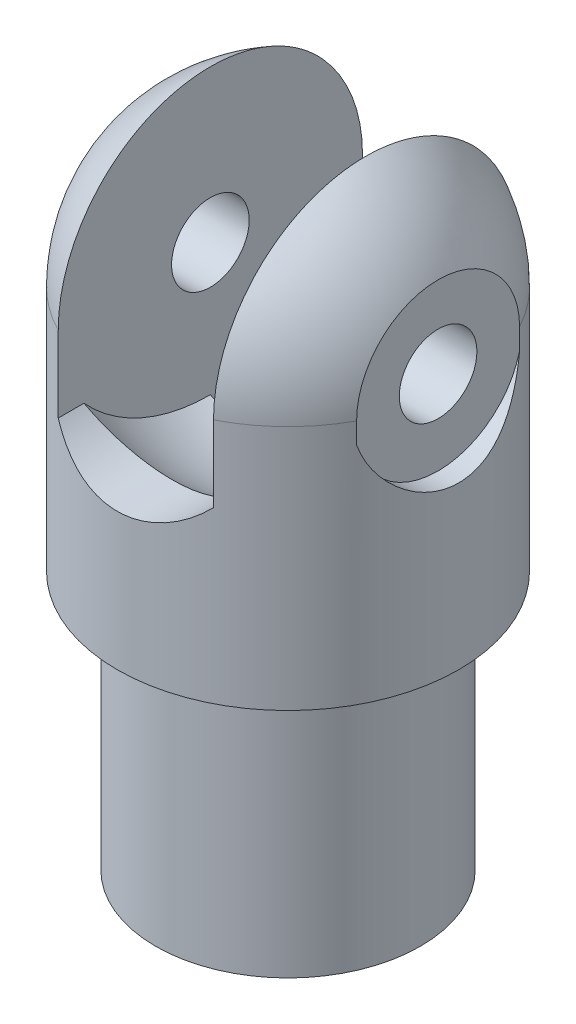
ISO-10303-21;
HEADER;
FILE_DESCRIPTION(('STEP AP214'),'2;1');
FILE_NAME('part.step','',(''),(''),'','','');
FILE_SCHEMA(('AUTOMOTIVE_DESIGN { 1 0 10303 214 1 1 1 1 }'));
ENDSEC;
DATA;
#1=APPLICATION_CONTEXT('core data for automotive mechanical design processes');
#2=APPLICATION_PROTOCOL_DEFINITION('international standard','automotive_design',2000,#1);
#3=PRODUCT_CONTEXT('',#1,'mechanical');
#4=PRODUCT('Part','Part','',(#3));
#5=PRODUCT_RELATED_PRODUCT_CATEGORY('part','',(#4));
#6=PRODUCT_DEFINITION_FORMATION('','',#4);
#7=PRODUCT_DEFINITION_CONTEXT('part definition',#1,'design');
#8=PRODUCT_DEFINITION('design','',#6,#7);
#9=PRODUCT_DEFINITION_SHAPE('','',#8);
#10=(LENGTH_UNIT() NAMED_UNIT(*) SI_UNIT(.MILLI.,.METRE.));
#11=(NAMED_UNIT(*) PLANE_ANGLE_UNIT() SI_UNIT($,.RADIAN.));
#12=(NAMED_UNIT(*) SI_UNIT($,.STERADIAN.) SOLID_ANGLE_UNIT());
#13=UNCERTAINTY_MEASURE_WITH_UNIT(LENGTH_MEASURE(1.E-05),#10,'distance_accuracy_value','');
#14=(GEOMETRIC_REPRESENTATION_CONTEXT(3) GLOBAL_UNCERTAINTY_ASSIGNED_CONTEXT((#13)) GLOBAL_UNIT_ASSIGNED_CONTEXT((#10,
#11,#12)) REPRESENTATION_CONTEXT('',''));
#15=CARTESIAN_POINT('',(0.,0.,0.));
#16=DIRECTION('',(0.,0.,1.));
#17=DIRECTION('',(1.,0.,0.));
#18=AXIS2_PLACEMENT_3D('',#15,#16,#17);
#19=CARTESIAN_POINT('',(0.,25.4,0.));
#20=DIRECTION('',(0.,-1.,0.));
#21=DIRECTION('',(0.,0.,-1.));
#22=AXIS2_PLACEMENT_3D('',#19,#20,#21);
#23=CYLINDRICAL_SURFACE('',#22,16.764);
#24=CARTESIAN_POINT('',(0.,25.4,0.));
#25=DIRECTION('',(0.,-1.,0.));
#26=DIRECTION('',(0.,0.,-1.));
#27=AXIS2_PLACEMENT_3D('',#24,#25,#26);
#28=CIRCLE('',#27,16.764);
#29=CARTESIAN_POINT('',(0.,25.4,-16.764));
#30=VERTEX_POINT('',#29);
#31=EDGE_CURVE('E236',#30,#30,#28,.T.);
#32=ORIENTED_EDGE('',*,*,#31,.F.);
#33=EDGE_LOOP('',(#32));
#34=FACE_BOUND('',#33,.T.);
#35=CARTESIAN_POINT('',(7.61999999999999,42.0639552639968,14.9320894720063));
#36=CARTESIAN_POINT('',(7.4187354852081,41.8585568840087,15.034819957129));
#37=CARTESIAN_POINT('',(7.20894008160445,41.661035373104,15.1367292765877));
#38=CARTESIAN_POINT('',(6.77286746114195,41.2827009786058,15.3367976218014));
#39=CARTESIAN_POINT('',(6.54657970393835,41.10189895096,15.4349541869733));
#40=CARTESIAN_POINT('',(6.07673523785476,40.7570307487092,15.6259329146887));
#41=CARTESIAN_POINT('',(5.83306935207745,40.5930897413555,15.718713220205));
#42=CARTESIAN_POINT('',(5.33087330112153,40.2847409589771,15.8960486553367));
#43=CARTESIAN_POINT('',(5.07234582932911,40.1403296603607,15.980605267913));
#44=CARTESIAN_POINT('',(4.54036630839052,39.8718184098008,16.13983294407));
#45=CARTESIAN_POINT('',(4.26685003788399,39.7478167415156,16.2144558599414));
#46=CARTESIAN_POINT('',(3.70761385723577,39.5224682129409,16.3513960340836));
#47=CARTESIAN_POINT('',(3.42189327894095,39.4211225949079,16.4137126175629));
#48=CARTESIAN_POINT('',(2.84128307573815,39.242860171486,16.5240985870674));
#49=CARTESIAN_POINT('',(2.54642642826642,39.1658646979068,16.5722138191775));
#50=CARTESIAN_POINT('',(1.94918624968593,39.0371373718316,16.6530213292175));
#51=CARTESIAN_POINT('',(1.64680391471342,38.9854015311695,16.6857160418182));
#52=CARTESIAN_POINT('',(1.07138351648276,38.9124266163785,16.7319348494627));
#53=CARTESIAN_POINT('',(0.798830436277251,38.88843155289,16.747189243116));
#54=CARTESIAN_POINT('',(0.252273090604535,38.8614751254296,16.7643306475044));
#55=CARTESIAN_POINT('',(-0.021731063055045,38.8585121638343,16.7662186735646));
#56=CARTESIAN_POINT('',(-0.569006378723166,38.8736673828163,16.7565767542411));
#57=CARTESIAN_POINT('',(-0.84227725698476,38.8917927967371,16.7450422048943));
#58=CARTESIAN_POINT('',(-1.38574945116511,38.9488577083326,16.7088466720074));
#59=CARTESIAN_POINT('',(-1.6559508304326,38.9877967756523,16.6841859598713));
#60=CARTESIAN_POINT('',(-2.17200537587847,39.0823956131128,16.6245801968547));
#61=CARTESIAN_POINT('',(-2.41821684336334,39.1366588261663,16.5904977627545));
#62=CARTESIAN_POINT('',(-2.9047665075282,39.2620066512659,16.5122609176541));
#63=CARTESIAN_POINT('',(-3.14510267729521,39.3330969805908,16.4681030835619));
#64=CARTESIAN_POINT('',(-3.61850862976368,39.4913289457519,16.3705988714167));
#65=CARTESIAN_POINT('',(-3.85157815189523,39.5784711564097,16.3172521643125));
#66=CARTESIAN_POINT('',(-4.30942439598687,39.7680072549068,16.2023545588355));
#67=CARTESIAN_POINT('',(-4.53419807890366,39.8704066641142,16.1408006912567));
#68=CARTESIAN_POINT('',(-4.99154553997148,40.098090825101,16.0055413845159));
#69=CARTESIAN_POINT('',(-5.22337293188519,40.2245343739291,15.9312638248066));
#70=CARTESIAN_POINT('',(-5.6753754595447,40.4931053770798,15.7758973143386));
#71=CARTESIAN_POINT('',(-5.89554929668169,40.6352345739041,15.6948076070651));
#72=CARTESIAN_POINT('',(-6.32325448015038,40.9340327262652,15.5274219468704));
#73=CARTESIAN_POINT('',(-6.53080072639641,41.0906839729432,15.4411323787132));
#74=CARTESIAN_POINT('',(-6.93292306963337,41.4177892833679,15.2648104591001));
#75=CARTESIAN_POINT('',(-7.12750275954461,41.5882394943036,15.1747791557678));
#76=CARTESIAN_POINT('',(-7.41896646673348,41.8628353930426,15.0334270672659));
#77=CARTESIAN_POINT('',(-7.52052819356979,41.9624337291835,14.9828538791537));
#78=CARTESIAN_POINT('',(-7.62000000000001,42.0639552639968,14.9320894720063));
#79=B_SPLINE_CURVE_WITH_KNOTS('',3,(#35,#36,#37,#38,#39,#40,#41,#42,#43,#44,#45,#46,#47,#48,#49,
#50,#51,#52,#53,#54,#55,#56,#57,#58,#59,#60,#61,#62,#63,#64,#65,#66,#67,#68,#69,#70,#71,#72,#73,
#74,#75,#76,#77,#78),.UNSPECIFIED.,.F.,.F.,(4,2,2,2,2,2,2,2,2,2,2,2,2,2,2,2,2,2,2,2,2,4),(0.,
0.91595587605546,1.83250236597254,2.75542456191241,3.67818001947663,4.60525668169747,
5.53238416409851,6.45648502448843,7.38043993420202,8.20143269149308,9.02236308453073,
9.84357514092238,10.6647702181281,11.4271776242784,12.1898444431668,12.9525385786402,
13.7155093959217,14.5376343358631,15.3598506968899,16.1810772775692,17.0020753490687,
17.454870133003),.UNSPECIFIED.);
#80=CARTESIAN_POINT('',(7.61999999999999,42.0639552639968,14.9320894720063));
#81=VERTEX_POINT('',#80);
#82=CARTESIAN_POINT('',(-7.62000000000001,42.0639552639968,14.9320894720062));
#83=VERTEX_POINT('',#82);
#84=EDGE_CURVE('E126',#81,#83,#79,.T.);
#85=ORIENTED_EDGE('',*,*,#84,.T.);
#86=DIRECTION('',(0.,-1.,0.));
#87=VECTOR('',#86,1.);
#88=CARTESIAN_POINT('',(-7.62000000000001,25.4,14.9320894720063));
#89=LINE('',#88,#87);
#90=CARTESIAN_POINT('',(-7.62000000000001,49.5299999999998,14.9320894720062));
#91=VERTEX_POINT('',#90);
#92=EDGE_CURVE('E134',#83,#91,#89,.F.);
#93=ORIENTED_EDGE('',*,*,#92,.T.);
#94=CARTESIAN_POINT('',(0.,49.53,0.));
#95=DIRECTION('',(0.,-1.,0.));
#96=DIRECTION('',(0.,0.,-1.));
#97=AXIS2_PLACEMENT_3D('',#94,#95,#96);
#98=CIRCLE('',#97,16.764);
#99=CARTESIAN_POINT('',(-14.732,49.53,7.99999199999599));
#100=VERTEX_POINT('',#99);
#101=EDGE_CURVE('E244',#91,#100,#98,.T.);
#102=ORIENTED_EDGE('',*,*,#101,.T.);
#103=DIRECTION('',(0.,-1.,0.));
#104=VECTOR('',#103,1.);
#105=CARTESIAN_POINT('',(-14.732,25.4,7.99999199999601));
#106=LINE('',#105,#104);
#107=CARTESIAN_POINT('',(-14.732,47.4940351181811,7.999991999996));
#108=VERTEX_POINT('',#107);
#109=EDGE_CURVE('E53',#100,#108,#106,.T.);
#110=ORIENTED_EDGE('',*,*,#109,.T.);
#111=CARTESIAN_POINT('',(-14.732,47.4940351181811,7.999991999996));
#112=CARTESIAN_POINT('',(-14.7632428149745,47.2676965830814,7.94241358215981));
#113=CARTESIAN_POINT('',(-14.7992408390983,47.0445110768314,7.87536493698053));
#114=CARTESIAN_POINT('',(-14.879188313626,46.6060089675617,7.72327688875927));
#115=CARTESIAN_POINT('',(-14.9231316908732,46.39068650436,7.6382512183925));
#116=CARTESIAN_POINT('',(-15.0173193540466,45.9697669038307,7.45135367046158));
#117=CARTESIAN_POINT('',(-15.0675440290785,45.7641421273517,7.34953392338279));
#118=CARTESIAN_POINT('',(-15.172784570775,45.3629649693112,7.12973781880571));
#119=CARTESIAN_POINT('',(-15.2278013555183,45.1674145292753,7.01175836291917));
#120=CARTESIAN_POINT('',(-15.3408377940109,44.7879154803039,6.7608624749813));
#121=CARTESIAN_POINT('',(-15.3988485487307,44.6039357301417,6.62798907245141));
#122=CARTESIAN_POINT('',(-15.5164536502358,44.247772245364,6.34779121039095));
#123=CARTESIAN_POINT('',(-15.576048519683,44.0755924727903,6.20046193704368));
#124=CARTESIAN_POINT('',(-15.6953215393529,43.7437713667053,5.89202328109875));
#125=CARTESIAN_POINT('',(-15.7549997161271,43.5841415256537,5.73090154380131));
#126=CARTESIAN_POINT('',(-15.8728994383717,43.2784275593615,5.39576817693684));
#127=CARTESIAN_POINT('',(-15.9311208999466,43.1323442129878,5.22175580724551));
#128=CARTESIAN_POINT('',(-16.0478628509385,42.8468007347405,4.85155017999724));
#129=CARTESIAN_POINT('',(-16.1062164025846,42.7081736847849,4.65466002551559));
#130=CARTESIAN_POINT('',(-16.2180568804278,42.4481591991597,4.24860570896111));
#131=CARTESIAN_POINT('',(-16.271545758772,42.3267648371098,4.03944652625551));
#132=CARTESIAN_POINT('',(-16.3721474970255,42.1023081457724,3.61013350428588));
#133=CARTESIAN_POINT('',(-16.419262715903,41.9992390296273,3.38998377428444));
#134=CARTESIAN_POINT('',(-16.5057477863901,41.8124944270932,2.9401400339747));
#135=CARTESIAN_POINT('',(-16.545118332013,41.7288172028441,2.71044688110503));
#136=CARTESIAN_POINT('',(-16.6128116427845,41.5862899211255,2.25731556721498));
#137=CARTESIAN_POINT('',(-16.6416555412932,41.5262514704973,2.03432900370458));
#138=CARTESIAN_POINT('',(-16.6906167773421,41.4249405685363,1.58318479412128));
#139=CARTESIAN_POINT('',(-16.710734420957,41.383667459004,1.35502732971389));
#140=CARTESIAN_POINT('',(-16.7416457550054,41.3204450568566,0.895538072447009));
#141=CARTESIAN_POINT('',(-16.752444102877,41.2984861116337,0.664207923970672));
#142=CARTESIAN_POINT('',(-16.7644091112563,41.2741622096633,0.200277254742219));
#143=CARTESIAN_POINT('',(-16.7655764400388,41.2717958934271,-0.0323231767470658));
#144=CARTESIAN_POINT('',(-16.7585774682984,41.286015963006,-0.475925150939787));
#145=CARTESIAN_POINT('',(-16.7512374738537,41.3009244339688,-0.686995954489339));
#146=CARTESIAN_POINT('',(-16.7287341668824,41.3468296178267,-1.10696138492675));
#147=CARTESIAN_POINT('',(-16.7135708234282,41.3778263943229,-1.31585600320827));
#148=CARTESIAN_POINT('',(-16.675793299344,41.4555611276885,-1.72998501250151));
#149=CARTESIAN_POINT('',(-16.6531797037887,41.5022978484928,-1.93521968959792));
#150=CARTESIAN_POINT('',(-16.6010418636704,41.6110232478168,-2.34070499905829));
#151=CARTESIAN_POINT('',(-16.5715174082148,41.6730123917843,-2.54095547911752));
#152=CARTESIAN_POINT('',(-16.5061109356301,41.8119173696252,-2.93602248687384));
#153=CARTESIAN_POINT('',(-16.4702050376366,41.8888893797212,-3.1308153054206));
#154=CARTESIAN_POINT('',(-16.3929194386841,42.0569362686502,-3.51311679042389));
#155=CARTESIAN_POINT('',(-16.351538025052,42.1480155615923,-3.70062315393017));
#156=CARTESIAN_POINT('',(-16.2204913759469,42.4413852655865,-4.25078418897575));
#157=CARTESIAN_POINT('',(-16.1238963619702,42.6638638179334,-4.60123949546831));
#158=CARTESIAN_POINT('',(-15.911072723423,43.1789899949749,-5.29262327700382));
#159=CARTESIAN_POINT('',(-15.7938609473103,43.4761316921131,-5.62990125852566));
#160=CARTESIAN_POINT('',(-15.6172315949704,43.9592130610402,-6.09602565455538));
#161=CARTESIAN_POINT('',(-15.5582044904555,44.1265164317535,-6.24480168645756));
#162=CARTESIAN_POINT('',(-15.4413018385372,44.4729525759345,-6.52850608220802));
#163=CARTESIAN_POINT('',(-15.3834263932282,44.652086392143,-6.66343322272471));
#164=CARTESIAN_POINT('',(-15.2660021267702,45.0355624724045,-6.92845533405348));
#165=CARTESIAN_POINT('',(-15.2066682552839,45.2407834857071,-7.05737592431754));
#166=CARTESIAN_POINT('',(-15.0930610282224,45.6628134689172,-7.29717698972182));
#167=CARTESIAN_POINT('',(-15.0387869161287,45.8796206988409,-7.40806016360996));
#168=CARTESIAN_POINT('',(-14.9370883073101,46.3242571421849,-7.61105063455357));
#169=CARTESIAN_POINT('',(-14.8896848786245,46.5521175119135,-7.70310052277909));
#170=CARTESIAN_POINT('',(-14.803725968713,47.016802057885,-7.8670033936605));
#171=CARTESIAN_POINT('',(-14.7651777545342,47.253633411848,-7.9388397988814));
#172=CARTESIAN_POINT('',(-14.732,47.4940351181811,-7.99999199999601));
#173=B_SPLINE_CURVE_WITH_KNOTS('',3,(#111,#112,#113,#114,#115,#116,#117,#118,#119,#120,#121,
#122,#123,#124,#125,#126,#127,#128,#129,#130,#131,#132,#133,#134,#135,#136,#137,#138,#139,#140,
#141,#142,#143,#144,#145,#146,#147,#148,#149,#150,#151,#152,#153,#154,#155,#156,#157,#158,#159,
#160,#161,#162,#163,#164,#165,#166,#167,#168,#169,#170,#171,#172),.UNSPECIFIED.,.F.,.F.,(4,2,2,
2,2,2,2,2,2,2,2,2,2,2,2,2,2,2,2,2,2,2,2,2,2,2,2,2,2,2,4),(0.,0.706505853907137,1.4124739444298,
2.11629051532642,2.8202422221719,3.52221018258879,4.2244126973953,4.92725093241565,
5.63012955268697,6.37249353165079,7.11455828028312,7.85634762598262,8.59807046836946,
9.29528988206071,9.99248483870202,10.6893311610708,11.3861291304239,12.0205410126832,
12.6549554029508,13.2893199839718,13.9237039258626,14.5605138847824,15.1975235028742,
16.4710365822318,17.8583634398683,18.552385977943,19.2464697693201,19.9940608696873,
20.7415400128165,21.491264794148,22.2416026577728),.UNSPECIFIED.);
#174=CARTESIAN_POINT('',(-14.732,47.4940351181811,-7.99999199999601));
#175=VERTEX_POINT('',#174);
#176=EDGE_CURVE('E46',#108,#175,#173,.T.);
#177=ORIENTED_EDGE('',*,*,#176,.T.);
#178=DIRECTION('',(0.,-1.,0.));
#179=VECTOR('',#178,1.);
#180=CARTESIAN_POINT('',(-14.732,25.4,-7.99999199999601));
#181=LINE('',#180,#179);
#182=CARTESIAN_POINT('',(-14.732,49.53,-7.99999199999602));
#183=VERTEX_POINT('',#182);
#184=EDGE_CURVE('E278',#175,#183,#181,.F.);
#185=ORIENTED_EDGE('',*,*,#184,.T.);
#186=CARTESIAN_POINT('',(-7.62000000000002,49.53,-14.9320894720063));
#187=VERTEX_POINT('',#186);
#188=EDGE_CURVE('E242',#183,#187,#98,.T.);
#189=ORIENTED_EDGE('',*,*,#188,.T.);
#190=DIRECTION('',(0.,-1.,0.));
#191=VECTOR('',#190,1.);
#192=CARTESIAN_POINT('',(-7.62000000000002,25.4,-14.9320894720063));
#193=LINE('',#192,#191);
#194=CARTESIAN_POINT('',(-7.62,42.4289866670171,-14.9320894720062));
#195=VERTEX_POINT('',#194);
#196=EDGE_CURVE('E245',#187,#195,#193,.T.);
#197=ORIENTED_EDGE('',*,*,#196,.T.);
#198=CARTESIAN_POINT('',(0.,42.4289866670171,0.));
#199=DIRECTION('',(0.,1.,0.));
#200=DIRECTION('',(0.,0.,1.));
#201=AXIS2_PLACEMENT_3D('',#198,#199,#200);
#202=CIRCLE('',#201,16.764);
#203=CARTESIAN_POINT('',(7.62,42.4289866670171,-14.9320894720063));
#204=VERTEX_POINT('',#203);
#205=EDGE_CURVE('E260',#204,#195,#202,.T.);
#206=ORIENTED_EDGE('',*,*,#205,.F.);
#207=DIRECTION('',(0.,-1.,0.));
#208=VECTOR('',#207,1.);
#209=CARTESIAN_POINT('',(7.61999999999998,25.4,-14.9320894720063));
#210=LINE('',#209,#208);
#211=CARTESIAN_POINT('',(7.61999999999998,49.53,-14.9320894720063));
#212=VERTEX_POINT('',#211);
#213=EDGE_CURVE('E311',#204,#212,#210,.F.);
#214=ORIENTED_EDGE('',*,*,#213,.T.);
#215=CARTESIAN_POINT('',(14.732,49.53,-7.99999199999602));
#216=VERTEX_POINT('',#215);
#217=EDGE_CURVE('E238',#212,#216,#98,.T.);
#218=ORIENTED_EDGE('',*,*,#217,.T.);
#219=DIRECTION('',(0.,-1.,0.));
#220=VECTOR('',#219,1.);
#221=CARTESIAN_POINT('',(14.732,25.4,-7.99999199999601));
#222=LINE('',#221,#220);
#223=CARTESIAN_POINT('',(14.732,47.4940351181811,-7.99999199999601));
#224=VERTEX_POINT('',#223);
#225=EDGE_CURVE('E61',#216,#224,#222,.T.);
#226=ORIENTED_EDGE('',*,*,#225,.T.);
#227=CARTESIAN_POINT('',(14.732,47.4940351181811,7.999991999996));
#228=CARTESIAN_POINT('',(14.7632428149745,47.2676965830814,7.94241358215981));
#229=CARTESIAN_POINT('',(14.7992408390983,47.0445110768314,7.87536493698053));
#230=CARTESIAN_POINT('',(14.879188313626,46.6060089675617,7.72327688875927));
#231=CARTESIAN_POINT('',(14.9231316908732,46.39068650436,7.6382512183925));
#232=CARTESIAN_POINT('',(15.0173193540466,45.9697669038307,7.45135367046158));
#233=CARTESIAN_POINT('',(15.0675440290785,45.7641421273517,7.34953392338279));
#234=CARTESIAN_POINT('',(15.172784570775,45.3629649693112,7.12973781880571));
#235=CARTESIAN_POINT('',(15.2278013555183,45.1674145292753,7.01175836291917));
#236=CARTESIAN_POINT('',(15.3408377940109,44.7879154803039,6.7608624749813));
#237=CARTESIAN_POINT('',(15.3988485487307,44.6039357301417,6.62798907245141));
#238=CARTESIAN_POINT('',(15.5164536502358,44.247772245364,6.34779121039095));
#239=CARTESIAN_POINT('',(15.576048519683,44.0755924727903,6.20046193704368));
#240=CARTESIAN_POINT('',(15.6953215393529,43.7437713667053,5.89202328109875));
#241=CARTESIAN_POINT('',(15.7549997161271,43.5841415256537,5.73090154380131));
#242=CARTESIAN_POINT('',(15.8728994383717,43.2784275593615,5.39576817693684));
#243=CARTESIAN_POINT('',(15.9311208999466,43.1323442129878,5.22175580724551));
#244=CARTESIAN_POINT('',(16.0478628509385,42.8468007347405,4.85155017999724));
#245=CARTESIAN_POINT('',(16.1062164025846,42.7081736847849,4.65466002551559));
#246=CARTESIAN_POINT('',(16.2180568804278,42.4481591991597,4.24860570896111));
#247=CARTESIAN_POINT('',(16.271545758772,42.3267648371098,4.03944652625551));
#248=CARTESIAN_POINT('',(16.3721474970255,42.1023081457724,3.61013350428588));
#249=CARTESIAN_POINT('',(16.419262715903,41.9992390296273,3.38998377428444));
#250=CARTESIAN_POINT('',(16.5057477863901,41.8124944270932,2.9401400339747));
#251=CARTESIAN_POINT('',(16.545118332013,41.7288172028441,2.71044688110503));
#252=CARTESIAN_POINT('',(16.6128116427845,41.5862899211255,2.25731556721498));
#253=CARTESIAN_POINT('',(16.6416555412932,41.5262514704973,2.03432900370458));
#254=CARTESIAN_POINT('',(16.6906167773421,41.4249405685363,1.58318479412128));
#255=CARTESIAN_POINT('',(16.710734420957,41.383667459004,1.35502732971389));
#256=CARTESIAN_POINT('',(16.7416457550054,41.3204450568566,0.895538072447009));
#257=CARTESIAN_POINT('',(16.752444102877,41.2984861116337,0.664207923970672));
#258=CARTESIAN_POINT('',(16.7644091112563,41.2741622096633,0.200277254742219));
#259=CARTESIAN_POINT('',(16.7655764400388,41.2717958934271,-0.0323231767470658));
#260=CARTESIAN_POINT('',(16.7585774682984,41.286015963006,-0.475925150939787));
#261=CARTESIAN_POINT('',(16.7512374738537,41.3009244339688,-0.686995954489339));
#262=CARTESIAN_POINT('',(16.7287341668824,41.3468296178267,-1.10696138492675));
#263=CARTESIAN_POINT('',(16.7135708234282,41.3778263943229,-1.31585600320827));
#264=CARTESIAN_POINT('',(16.675793299344,41.4555611276885,-1.72998501250151));
#265=CARTESIAN_POINT('',(16.6531797037887,41.5022978484928,-1.93521968959792));
#266=CARTESIAN_POINT('',(16.6010418636704,41.6110232478168,-2.34070499905829));
#267=CARTESIAN_POINT('',(16.5715174082148,41.6730123917843,-2.54095547911752));
#268=CARTESIAN_POINT('',(16.5061109356301,41.8119173696252,-2.93602248687384));
#269=CARTESIAN_POINT('',(16.4702050376366,41.8888893797212,-3.1308153054206));
#270=CARTESIAN_POINT('',(16.3929194386841,42.0569362686502,-3.51311679042389));
#271=CARTESIAN_POINT('',(16.351538025052,42.1480155615923,-3.70062315393017));
#272=CARTESIAN_POINT('',(16.2204913759469,42.4413852655865,-4.25078418897575));
#273=CARTESIAN_POINT('',(16.1238963619702,42.6638638179334,-4.60123949546831));
#274=CARTESIAN_POINT('',(15.911072723423,43.1789899949749,-5.29262327700382));
#275=CARTESIAN_POINT('',(15.7938609473103,43.4761316921131,-5.62990125852566));
#276=CARTESIAN_POINT('',(15.6172315949704,43.9592130610402,-6.09602565455538));
#277=CARTESIAN_POINT('',(15.5582044904555,44.1265164317535,-6.24480168645756));
#278=CARTESIAN_POINT('',(15.4413018385372,44.4729525759345,-6.52850608220802));
#279=CARTESIAN_POINT('',(15.3834263932282,44.652086392143,-6.66343322272471));
#280=CARTESIAN_POINT('',(15.2660021267702,45.0355624724045,-6.92845533405348));
#281=CARTESIAN_POINT('',(15.2066682552839,45.2407834857071,-7.05737592431754));
#282=CARTESIAN_POINT('',(15.0930610282224,45.6628134689172,-7.29717698972182));
#283=CARTESIAN_POINT('',(15.0387869161287,45.8796206988409,-7.40806016360996));
#284=CARTESIAN_POINT('',(14.9370883073101,46.3242571421849,-7.61105063455357));
#285=CARTESIAN_POINT('',(14.8896848786245,46.5521175119135,-7.70310052277909));
#286=CARTESIAN_POINT('',(14.803725968713,47.016802057885,-7.8670033936605));
#287=CARTESIAN_POINT('',(14.7651777545342,47.253633411848,-7.9388397988814));
#288=CARTESIAN_POINT('',(14.732,47.4940351181811,-7.99999199999601));
#289=B_SPLINE_CURVE_WITH_KNOTS('',3,(#227,#228,#229,#230,#231,#232,#233,#234,#235,#236,#237,
#238,#239,#240,#241,#242,#243,#244,#245,#246,#247,#248,#249,#250,#251,#252,#253,#254,#255,#256,
#257,#258,#259,#260,#261,#262,#263,#264,#265,#266,#267,#268,#269,#270,#271,#272,#273,#274,#275,
#276,#277,#278,#279,#280,#281,#282,#283,#284,#285,#286,#287,#288),.UNSPECIFIED.,.F.,.F.,(4,2,2,
2,2,2,2,2,2,2,2,2,2,2,2,2,2,2,2,2,2,2,2,2,2,2,2,2,2,2,4),(0.,0.706505853907137,1.4124739444298,
2.11629051532642,2.8202422221719,3.52221018258879,4.2244126973953,4.92725093241565,
5.63012955268697,6.37249353165079,7.11455828028312,7.85634762598262,8.59807046836946,
9.29528988206071,9.99248483870202,10.6893311610708,11.3861291304239,12.0205410126832,
12.6549554029508,13.2893199839718,13.9237039258626,14.5605138847824,15.1975235028742,
16.4710365822318,17.8583634398683,18.552385977943,19.2464697693201,19.9940608696873,
20.7415400128165,21.491264794148,22.2416026577728),.UNSPECIFIED.);
#290=CARTESIAN_POINT('',(14.732,47.4940351181811,7.999991999996));
#291=VERTEX_POINT('',#290);
#292=EDGE_CURVE('E184',#291,#224,#289,.T.);
#293=ORIENTED_EDGE('',*,*,#292,.F.);
#294=DIRECTION('',(0.,-1.,0.));
#295=VECTOR('',#294,1.);
#296=CARTESIAN_POINT('',(14.732,25.4,7.99999199999601));
#297=LINE('',#296,#295);
#298=CARTESIAN_POINT('',(14.732,49.53,7.99999199999599));
#299=VERTEX_POINT('',#298);
#300=EDGE_CURVE('E266',#291,#299,#297,.F.);
#301=ORIENTED_EDGE('',*,*,#300,.T.);
#302=CARTESIAN_POINT('',(7.61999999999999,49.5299999999998,14.9320894720062));
#303=VERTEX_POINT('',#302);
#304=EDGE_CURVE('E129',#299,#303,#98,.T.);
#305=ORIENTED_EDGE('',*,*,#304,.T.);
#306=DIRECTION('',(0.,-1.,0.));
#307=VECTOR('',#306,1.);
#308=CARTESIAN_POINT('',(7.61999999999999,25.4,14.9320894720063));
#309=LINE('',#308,#307);
#310=EDGE_CURVE('E123',#303,#81,#309,.T.);
#311=ORIENTED_EDGE('',*,*,#310,.T.);
#312=EDGE_LOOP('',(#85,#93,#102,#110,#177,#185,#189,#197,#206,#214,#218,#226,#293,#301,#305,#311));
#313=FACE_BOUND('',#312,.T.);
#314=ADVANCED_FACE('F32',(#34,#313),#23,.T.);
#315=CARTESIAN_POINT('',(0.,53.34,-1.73472347597681E-13));
#316=DIRECTION('',(1.,0.,0.));
#317=DIRECTION('',(0.,0.,-1.));
#318=AXIS2_PLACEMENT_3D('',#315,#316,#317);
#319=SPHERICAL_SURFACE('',#318,18.415);
#320=CARTESIAN_POINT('',(-7.62000000000001,53.34,0.));
#321=DIRECTION('',(1.,0.,0.));
#322=DIRECTION('',(0.,0.,-1.));
#323=AXIS2_PLACEMENT_3D('',#320,#321,#322);
#324=CIRCLE('',#323,16.7644810537042);
#325=CARTESIAN_POINT('',(-7.62000000000001,42.0639552639968,12.405589067499));
#326=VERTEX_POINT('',#325);
#327=CARTESIAN_POINT('',(-7.62000000000001,36.5755189462958,0.));
#328=VERTEX_POINT('',#327);
#329=EDGE_CURVE('E296',#326,#328,#324,.T.);
#330=ORIENTED_EDGE('',*,*,#329,.F.);
#331=CARTESIAN_POINT('',(-7.6202,42.0641593936114,12.4056517595535));
#332=CARTESIAN_POINT('',(-7.41591175126259,41.8556092777909,12.3416062722609));
#333=CARTESIAN_POINT('',(-7.20270661171368,41.6551566139765,12.2795435797974));
#334=CARTESIAN_POINT('',(-6.75976984180453,41.2718291843324,12.1600240854154));
#335=CARTESIAN_POINT('',(-6.53003511981702,41.0889577218411,12.1025681493974));
#336=CARTESIAN_POINT('',(-6.05518399892413,40.7420795730825,11.9928715103087));
#337=CARTESIAN_POINT('',(-5.81005227198328,40.5780921614642,11.940636142846));
#338=CARTESIAN_POINT('',(-5.30618499227165,40.2705332312444,11.8420940410508));
#339=CARTESIAN_POINT('',(-5.0474504443303,40.1269602075428,11.7957868696728));
#340=CARTESIAN_POINT('',(-4.51759842553558,39.8612088268222,11.7096359109734));
#341=CARTESIAN_POINT('',(-4.24646012309137,39.7390682621254,11.6698035497523));
#342=CARTESIAN_POINT('',(-3.69410571716476,39.5175908546552,11.5972695142104));
#343=CARTESIAN_POINT('',(-3.41288995803432,39.4182532335506,11.5645675965084));
#344=CARTESIAN_POINT('',(-2.84262991303489,39.243379988658,11.5068106524053));
#345=CARTESIAN_POINT('',(-2.55359205758001,39.1678254222225,11.4817495407832));
#346=CARTESIAN_POINT('',(-1.96964133720382,39.0411492874739,11.4396373845609));
#347=CARTESIAN_POINT('',(-1.67472869421944,38.9900267979856,11.4225860379649));
#348=CARTESIAN_POINT('',(-1.09058803359953,38.9139337156648,11.3971765022506));
#349=CARTESIAN_POINT('',(-0.801471007907897,38.8881946567003,11.3885629236798));
#350=CARTESIAN_POINT('',(-0.221975036204196,38.8603658284535,11.3792491318658));
#351=CARTESIAN_POINT('',(0.068403888522654,38.858275661808,11.3785487856596));
#352=CARTESIAN_POINT('',(0.648281373100163,38.8777646159474,11.3850725833791));
#353=CARTESIAN_POINT('',(0.93777991399602,38.899344242779,11.3922968967296));
#354=CARTESIAN_POINT('',(1.51375652547411,38.9659662080439,11.4145559171764));
#355=CARTESIAN_POINT('',(1.80023463294235,39.0110082596108,11.4295905287792));
#356=CARTESIAN_POINT('',(2.36284187716642,39.1230815239176,11.4668880754641));
#357=CARTESIAN_POINT('',(2.63906442712101,39.1896909426742,11.4890122795545));
#358=CARTESIAN_POINT('',(3.18472405294299,39.3445110523887,11.540239605959));
#359=CARTESIAN_POINT('',(3.45416107390748,39.4327219180656,11.5693427847211));
#360=CARTESIAN_POINT('',(3.98455517315899,39.6300183544698,11.6341346648486));
#361=CARTESIAN_POINT('',(4.2455094805844,39.7391106674966,11.6698254931319));
#362=CARTESIAN_POINT('',(4.7571839229519,39.9772493574876,11.7473163218381));
#363=CARTESIAN_POINT('',(5.00790478989487,40.1062943040616,11.7891158843184));
#364=CARTESIAN_POINT('',(5.47141717910601,40.3685070797927,11.8735382364478));
#365=CARTESIAN_POINT('',(5.68539875453464,40.499760603603,11.915595694435));
#366=CARTESIAN_POINT('',(6.10300279379096,40.7765815911094,12.0037826220999));
#367=CARTESIAN_POINT('',(6.30662571238238,40.9221484256012,12.0499119127733));
#368=CARTESIAN_POINT('',(6.7023258954026,41.2265513810013,12.1457775601294));
#369=CARTESIAN_POINT('',(6.89441881041821,41.385368781897,12.1955088153789));
#370=CARTESIAN_POINT('',(7.26655016052219,41.7155631438424,12.2982333765868));
#371=CARTESIAN_POINT('',(7.44658901804325,41.8869396643181,12.3512265681062));
#372=CARTESIAN_POINT('',(7.62019999999999,42.0641593936114,12.4056517595535));
#373=B_SPLINE_CURVE_WITH_KNOTS('',3,(#331,#332,#333,#334,#335,#336,#337,#338,#339,#340,#341,
#342,#343,#344,#345,#346,#347,#348,#349,#350,#351,#352,#353,#354,#355,#356,#357,#358,#359,#360,
#361,#362,#363,#364,#365,#366,#367,#368,#369,#370,#371,#372),.UNSPECIFIED.,.F.,.F.,(4,2,2,2,2,2,
2,2,2,2,2,2,2,2,2,2,2,2,2,2,4),(0.,0.896420140629918,1.79300838215053,2.69050379425192,
3.5879330019861,4.4869291026557,5.38589451339683,6.28414209681383,7.1823558104656,
8.05245559304711,8.92254075565564,9.7926445205544,10.6627376472712,11.5167495418612,
12.3707683441901,13.2250633626857,14.0792971657408,14.8422431747346,15.605155660065,
16.3670080064288,17.1288336397981),.UNSPECIFIED.);
#374=CARTESIAN_POINT('',(7.61999999999999,42.0639552639968,12.405589067499));
#375=VERTEX_POINT('',#374);
#376=EDGE_CURVE('E11',#326,#375,#373,.T.);
#377=ORIENTED_EDGE('',*,*,#376,.T.);
#378=CARTESIAN_POINT('',(7.61999999999999,53.34,0.));
#379=DIRECTION('',(1.,0.,0.));
#380=DIRECTION('',(0.,0.,-1.));
#381=AXIS2_PLACEMENT_3D('',#378,#379,#380);
#382=CIRCLE('',#381,16.7644810537042);
#383=CARTESIAN_POINT('',(7.61999999999999,36.575518946296,0.));
#384=VERTEX_POINT('',#383);
#385=EDGE_CURVE('E148',#375,#384,#382,.T.);
#386=ORIENTED_EDGE('',*,*,#385,.T.);
#387=CARTESIAN_POINT('',(0.,53.3399999999998,0.));
#388=DIRECTION('',(0.,0.,1.));
#389=DIRECTION('',(1.,0.,0.));
#390=AXIS2_PLACEMENT_3D('',#387,#388,#389);
#391=CIRCLE('',#390,18.415);
#392=EDGE_CURVE('E292',#328,#384,#391,.T.);
#393=ORIENTED_EDGE('',*,*,#392,.F.);
#394=EDGE_LOOP('',(#330,#377,#386,#393));
#395=FACE_BOUND('',#394,.T.);
#396=ADVANCED_FACE('F195',(#395),#319,.F.);
#397=CARTESIAN_POINT('',(-16.764,49.53,0.));
#398=DIRECTION('',(1.,0.,0.));
#399=DIRECTION('',(0.,0.,-1.));
#400=AXIS2_PLACEMENT_3D('',#397,#398,#399);
#401=CYLINDRICAL_SURFACE('',#400,3.81);
#402=CARTESIAN_POINT('',(-7.62,49.53,0.));
#403=DIRECTION('',(1.,0.,0.));
#404=DIRECTION('',(0.,1.,0.));
#405=AXIS2_PLACEMENT_3D('',#402,#403,#404);
#406=CIRCLE('',#405,3.81);
#407=CARTESIAN_POINT('',(-7.62,53.34,0.));
#408=VERTEX_POINT('',#407);
#409=EDGE_CURVE('E258',#408,#408,#406,.F.);
#410=ORIENTED_EDGE('',*,*,#409,.F.);
#411=EDGE_LOOP('',(#410));
#412=FACE_BOUND('',#411,.T.);
#413=CARTESIAN_POINT('',(-14.732,49.53,0.));
#414=DIRECTION('',(-1.,0.,0.));
#415=DIRECTION('',(0.,0.,1.));
#416=AXIS2_PLACEMENT_3D('',#413,#414,#415);
#417=CIRCLE('',#416,3.81);
#418=CARTESIAN_POINT('',(-14.732,49.53,3.80999999999999));
#419=VERTEX_POINT('',#418);
#420=EDGE_CURVE('E282',#419,#419,#417,.F.);
#421=ORIENTED_EDGE('',*,*,#420,.F.);
#422=EDGE_LOOP('',(#421));
#423=FACE_BOUND('',#422,.T.);
#424=ADVANCED_FACE('F199',(#412,#423),#401,.F.);
#425=CARTESIAN_POINT('',(0.,49.53,0.));
#426=DIRECTION('',(0.,-1.,0.));
#427=DIRECTION('',(0.,0.,1.));
#428=AXIS2_PLACEMENT_3D('',#425,#426,#427);
#429=SPHERICAL_SURFACE('',#428,16.764);
#430=CARTESIAN_POINT('',(-14.732,49.53,0.));
#431=DIRECTION('',(-1.,0.,0.));
#432=DIRECTION('',(0.,0.,1.));
#433=AXIS2_PLACEMENT_3D('',#430,#431,#432);
#434=CIRCLE('',#433,7.99999199999601);
#435=EDGE_CURVE('E182',#100,#183,#434,.T.);
#436=ORIENTED_EDGE('',*,*,#435,.F.);
#437=ORIENTED_EDGE('',*,*,#101,.F.);
#438=CARTESIAN_POINT('',(-7.62,49.53,0.));
#439=DIRECTION('',(1.,0.,0.));
#440=DIRECTION('',(0.,1.,0.));
#441=AXIS2_PLACEMENT_3D('',#438,#439,#440);
#442=CIRCLE('',#441,14.9320894720063);
#443=EDGE_CURVE('E239',#187,#91,#442,.T.);
#444=ORIENTED_EDGE('',*,*,#443,.F.);
#445=ORIENTED_EDGE('',*,*,#188,.F.);
#446=EDGE_LOOP('',(#436,#437,#444,#445));
#447=FACE_BOUND('',#446,.T.);
#448=ADVANCED_FACE('F218',(#447),#429,.T.);
#449=CARTESIAN_POINT('',(7.61999999999999,49.53,0.));
#450=DIRECTION('',(-1.,0.,0.));
#451=DIRECTION('',(0.,-1.,0.));
#452=AXIS2_PLACEMENT_3D('',#449,#450,#451);
#453=CIRCLE('',#452,3.81);
#454=CARTESIAN_POINT('',(7.61999999999999,45.72,0.));
#455=VERTEX_POINT('',#454);
#456=EDGE_CURVE('E252',#455,#455,#453,.F.);
#457=ORIENTED_EDGE('',*,*,#456,.F.);
#458=EDGE_LOOP('',(#457));
#459=FACE_BOUND('',#458,.T.);
#460=CARTESIAN_POINT('',(14.732,49.53,0.));
#461=DIRECTION('',(1.,0.,0.));
#462=DIRECTION('',(0.,0.,-1.));
#463=AXIS2_PLACEMENT_3D('',#460,#461,#462);
#464=CIRCLE('',#463,3.81);
#465=CARTESIAN_POINT('',(14.732,49.53,-3.81000000000001));
#466=VERTEX_POINT('',#465);
#467=EDGE_CURVE('E269',#466,#466,#464,.F.);
#468=ORIENTED_EDGE('',*,*,#467,.F.);
#469=EDGE_LOOP('',(#468));
#470=FACE_BOUND('',#469,.T.);
#471=ADVANCED_FACE('F215',(#459,#470),#401,.F.);
#472=CARTESIAN_POINT('',(14.732,49.53,0.));
#473=DIRECTION('',(1.,0.,0.));
#474=DIRECTION('',(0.,0.,-1.));
#475=AXIS2_PLACEMENT_3D('',#472,#473,#474);
#476=CIRCLE('',#475,7.99999199999601);
#477=EDGE_CURVE('E190',#216,#299,#476,.T.);
#478=ORIENTED_EDGE('',*,*,#477,.F.);
#479=ORIENTED_EDGE('',*,*,#217,.F.);
#480=CARTESIAN_POINT('',(7.61999999999999,49.53,0.));
#481=DIRECTION('',(-1.,0.,0.));
#482=DIRECTION('',(0.,-1.,0.));
#483=AXIS2_PLACEMENT_3D('',#480,#481,#482);
#484=CIRCLE('',#483,14.9320894720063);
#485=EDGE_CURVE('E271',#303,#212,#484,.T.);
#486=ORIENTED_EDGE('',*,*,#485,.F.);
#487=ORIENTED_EDGE('',*,*,#304,.F.);
#488=EDGE_LOOP('',(#478,#479,#486,#487));
#489=FACE_BOUND('',#488,.T.);
#490=ADVANCED_FACE('F217',(#489),#429,.T.);
#491=CARTESIAN_POINT('',(0.,25.4,0.));
#492=DIRECTION('',(0.,-1.,0.));
#493=DIRECTION('',(0.,0.,-1.));
#494=AXIS2_PLACEMENT_3D('',#491,#492,#493);
#495=CYLINDRICAL_SURFACE('',#494,12.9921);
#496=CARTESIAN_POINT('',(0.,25.4,0.));
#497=DIRECTION('',(0.,1.,0.));
#498=DIRECTION('',(0.,0.,1.));
#499=AXIS2_PLACEMENT_3D('',#496,#497,#498);
#500=CIRCLE('',#499,12.9921);
#501=CARTESIAN_POINT('',(0.,25.4,12.9921));
#502=VERTEX_POINT('',#501);
#503=EDGE_CURVE('E249',#502,#502,#500,.T.);
#504=ORIENTED_EDGE('',*,*,#503,.F.);
#505=EDGE_LOOP('',(#504));
#506=FACE_BOUND('',#505,.T.);
#507=CARTESIAN_POINT('',(0.,0.,0.));
#508=DIRECTION('',(0.,1.,0.));
#509=DIRECTION('',(0.,0.,1.));
#510=AXIS2_PLACEMENT_3D('',#507,#508,#509);
#511=CIRCLE('',#510,12.9921);
#512=CARTESIAN_POINT('',(0.,0.,12.9921));
#513=VERTEX_POINT('',#512);
#514=EDGE_CURVE('E253',#513,#513,#511,.T.);
#515=ORIENTED_EDGE('',*,*,#514,.T.);
#516=EDGE_LOOP('',(#515));
#517=FACE_BOUND('',#516,.T.);
#518=ADVANCED_FACE('F34',(#506,#517),#495,.T.);
#519=CARTESIAN_POINT('',(0.,0.,0.));
#520=DIRECTION('',(0.,1.,0.));
#521=DIRECTION('',(0.,0.,1.));
#522=AXIS2_PLACEMENT_3D('',#519,#520,#521);
#523=PLANE('',#522);
#524=ORIENTED_EDGE('',*,*,#514,.F.);
#525=EDGE_LOOP('',(#524));
#526=FACE_BOUND('',#525,.T.);
#527=ADVANCED_FACE('F423',(#526),#523,.F.);
#528=CARTESIAN_POINT('',(0.,25.4,0.));
#529=DIRECTION('',(0.,-1.,0.));
#530=DIRECTION('',(0.,0.,-1.));
#531=AXIS2_PLACEMENT_3D('',#528,#529,#530);
#532=PLANE('',#531);
#533=ORIENTED_EDGE('',*,*,#503,.T.);
#534=EDGE_LOOP('',(#533));
#535=FACE_BOUND('',#534,.T.);
#536=ORIENTED_EDGE('',*,*,#31,.T.);
#537=EDGE_LOOP('',(#536));
#538=FACE_BOUND('',#537,.T.);
#539=ADVANCED_FACE('F209',(#535,#538),#532,.T.);
#540=CARTESIAN_POINT('',(-7.62,49.5299999999998,16.5345603617151));
#541=DIRECTION('',(1.,0.,0.));
#542=DIRECTION('',(0.,1.,0.));
#543=AXIS2_PLACEMENT_3D('',#540,#541,#542);
#544=PLANE('',#543);
#545=ORIENTED_EDGE('',*,*,#409,.T.);
#546=EDGE_LOOP('',(#545));
#547=FACE_BOUND('',#546,.T.);
#548=DIRECTION('',(0.,0.,-1.));
#549=VECTOR('',#548,1.);
#550=CARTESIAN_POINT('',(-7.62000000000001,42.0639552639968,24.638));
#551=LINE('',#550,#549);
#552=EDGE_CURVE('E141',#83,#326,#551,.T.);
#553=ORIENTED_EDGE('',*,*,#552,.T.);
#554=ORIENTED_EDGE('',*,*,#329,.T.);
#555=DIRECTION('',(0.,1.,0.));
#556=VECTOR('',#555,1.);
#557=CARTESIAN_POINT('',(-7.62000000000001,32.9954396382849,0.));
#558=LINE('',#557,#556);
#559=CARTESIAN_POINT('',(-7.62000000000001,32.9954396382849,0.));
#560=VERTEX_POINT('',#559);
#561=EDGE_CURVE('E133',#560,#328,#558,.T.);
#562=ORIENTED_EDGE('',*,*,#561,.F.);
#563=CARTESIAN_POINT('',(-7.62,49.53,0.));
#564=DIRECTION('',(-1.,0.,0.));
#565=DIRECTION('',(0.,-1.,0.));
#566=AXIS2_PLACEMENT_3D('',#563,#564,#565);
#567=CIRCLE('',#566,16.5345603617151);
#568=EDGE_CURVE('E309',#195,#560,#567,.T.);
#569=ORIENTED_EDGE('',*,*,#568,.F.);
#570=ORIENTED_EDGE('',*,*,#196,.F.);
#571=ORIENTED_EDGE('',*,*,#443,.T.);
#572=ORIENTED_EDGE('',*,*,#92,.F.);
#573=EDGE_LOOP('',(#553,#554,#562,#569,#570,#571,#572));
#574=FACE_BOUND('',#573,.T.);
#575=ADVANCED_FACE('F206',(#547,#574),#544,.T.);
#576=CARTESIAN_POINT('',(7.61999999999999,49.53,0.));
#577=DIRECTION('',(-1.,0.,0.));
#578=DIRECTION('',(0.,-1.,0.));
#579=AXIS2_PLACEMENT_3D('',#576,#577,#578);
#580=PLANE('',#579);
#581=ORIENTED_EDGE('',*,*,#310,.F.);
#582=ORIENTED_EDGE('',*,*,#485,.T.);
#583=ORIENTED_EDGE('',*,*,#213,.F.);
#584=CARTESIAN_POINT('',(7.62,49.53,0.));
#585=DIRECTION('',(-1.,0.,0.));
#586=DIRECTION('',(0.,-1.,0.));
#587=AXIS2_PLACEMENT_3D('',#584,#585,#586);
#588=CIRCLE('',#587,16.5345603617151);
#589=CARTESIAN_POINT('',(7.61999999999999,32.9954396382848,0.));
#590=VERTEX_POINT('',#589);
#591=EDGE_CURVE('E306',#204,#590,#588,.T.);
#592=ORIENTED_EDGE('',*,*,#591,.T.);
#593=DIRECTION('',(0.,-1.,0.));
#594=VECTOR('',#593,1.);
#595=CARTESIAN_POINT('',(7.61999999999999,49.53,0.));
#596=LINE('',#595,#594);
#597=EDGE_CURVE('E301',#384,#590,#596,.T.);
#598=ORIENTED_EDGE('',*,*,#597,.F.);
#599=ORIENTED_EDGE('',*,*,#385,.F.);
#600=DIRECTION('',(0.,0.,-1.));
#601=VECTOR('',#600,1.);
#602=CARTESIAN_POINT('',(7.61999999999999,42.0639552639968,24.638));
#603=LINE('',#602,#601);
#604=EDGE_CURVE('E139',#81,#375,#603,.T.);
#605=ORIENTED_EDGE('',*,*,#604,.F.);
#606=EDGE_LOOP('',(#581,#582,#583,#592,#598,#599,#605));
#607=FACE_BOUND('',#606,.T.);
#608=ORIENTED_EDGE('',*,*,#456,.T.);
#609=EDGE_LOOP('',(#608));
#610=FACE_BOUND('',#609,.T.);
#611=ADVANCED_FACE('F145',(#607,#610),#580,.T.);
#612=CARTESIAN_POINT('',(0.,49.53,0.));
#613=DIRECTION('',(0.,0.,1.));
#614=DIRECTION('',(1.,0.,0.));
#615=AXIS2_PLACEMENT_3D('',#612,#613,#614);
#616=PLANE('',#615);
#617=ORIENTED_EDGE('',*,*,#392,.T.);
#618=ORIENTED_EDGE('',*,*,#597,.T.);
#619=CARTESIAN_POINT('',(0.,49.53,0.));
#620=DIRECTION('',(0.,0.,1.));
#621=DIRECTION('',(1.,0.,0.));
#622=AXIS2_PLACEMENT_3D('',#619,#620,#621);
#623=CIRCLE('',#622,18.2059354704778);
#624=EDGE_CURVE('E303',#560,#590,#623,.T.);
#625=ORIENTED_EDGE('',*,*,#624,.F.);
#626=ORIENTED_EDGE('',*,*,#561,.T.);
#627=EDGE_LOOP('',(#617,#618,#625,#626));
#628=FACE_BOUND('',#627,.T.);
#629=ADVANCED_FACE('F201',(#628),#616,.F.);
#630=CARTESIAN_POINT('',(0.,49.53,0.));
#631=DIRECTION('',(-1.,0.,0.));
#632=DIRECTION('',(0.,0.,1.));
#633=AXIS2_PLACEMENT_3D('',#630,#631,#632);
#634=SPHERICAL_SURFACE('',#633,18.2059354704778);
#635=ORIENTED_EDGE('',*,*,#205,.T.);
#636=ORIENTED_EDGE('',*,*,#568,.T.);
#637=ORIENTED_EDGE('',*,*,#624,.T.);
#638=ORIENTED_EDGE('',*,*,#591,.F.);
#639=EDGE_LOOP('',(#635,#636,#637,#638));
#640=FACE_BOUND('',#639,.T.);
#641=ADVANCED_FACE('F204',(#640),#634,.F.);
#642=CARTESIAN_POINT('',(14.732,49.53,0.));
#643=DIRECTION('',(1.,0.,0.));
#644=DIRECTION('',(0.,0.,-1.));
#645=AXIS2_PLACEMENT_3D('',#642,#643,#644);
#646=PLANE('',#645);
#647=CARTESIAN_POINT('',(14.732,49.53,0.));
#648=DIRECTION('',(1.,0.,0.));
#649=DIRECTION('',(0.,0.,-1.));
#650=AXIS2_PLACEMENT_3D('',#647,#648,#649);
#651=CIRCLE('',#650,8.255);
#652=EDGE_CURVE('E285',#291,#224,#651,.T.);
#653=ORIENTED_EDGE('',*,*,#652,.T.);
#654=ORIENTED_EDGE('',*,*,#225,.F.);
#655=ORIENTED_EDGE('',*,*,#477,.T.);
#656=ORIENTED_EDGE('',*,*,#300,.F.);
#657=EDGE_LOOP('',(#653,#654,#655,#656));
#658=FACE_BOUND('',#657,.T.);
#659=ORIENTED_EDGE('',*,*,#467,.T.);
#660=EDGE_LOOP('',(#659));
#661=FACE_BOUND('',#660,.T.);
#662=ADVANCED_FACE('F174',(#658,#661),#646,.T.);
#663=CARTESIAN_POINT('',(14.732,49.53,0.));
#664=DIRECTION('',(1.,0.,0.));
#665=DIRECTION('',(0.,0.,-1.));
#666=AXIS2_PLACEMENT_3D('',#663,#664,#665);
#667=CYLINDRICAL_SURFACE('',#666,8.255);
#668=ORIENTED_EDGE('',*,*,#652,.F.);
#669=ORIENTED_EDGE('',*,*,#292,.T.);
#670=EDGE_LOOP('',(#668,#669));
#671=FACE_BOUND('',#670,.T.);
#672=ADVANCED_FACE('F169',(#671),#667,.F.);
#673=CARTESIAN_POINT('',(-14.732,49.53,0.));
#674=DIRECTION('',(-1.,0.,0.));
#675=DIRECTION('',(0.,0.,-1.));
#676=AXIS2_PLACEMENT_3D('',#673,#674,#675);
#677=PLANE('',#676);
#678=CARTESIAN_POINT('',(-14.732,49.53,0.));
#679=DIRECTION('',(1.,0.,0.));
#680=DIRECTION('',(0.,0.,-1.));
#681=AXIS2_PLACEMENT_3D('',#678,#679,#680);
#682=CIRCLE('',#681,8.255);
#683=EDGE_CURVE('E142',#108,#175,#682,.T.);
#684=ORIENTED_EDGE('',*,*,#683,.F.);
#685=ORIENTED_EDGE('',*,*,#109,.F.);
#686=ORIENTED_EDGE('',*,*,#435,.T.);
#687=ORIENTED_EDGE('',*,*,#184,.F.);
#688=EDGE_LOOP('',(#684,#685,#686,#687));
#689=FACE_BOUND('',#688,.T.);
#690=ORIENTED_EDGE('',*,*,#420,.T.);
#691=EDGE_LOOP('',(#690));
#692=FACE_BOUND('',#691,.T.);
#693=ADVANCED_FACE('F165',(#689,#692),#677,.T.);
#694=CARTESIAN_POINT('',(-14.732,49.53,0.));
#695=DIRECTION('',(-1.,0.,0.));
#696=DIRECTION('',(0.,0.,1.));
#697=AXIS2_PLACEMENT_3D('',#694,#695,#696);
#698=CYLINDRICAL_SURFACE('',#697,8.255);
#699=ORIENTED_EDGE('',*,*,#683,.T.);
#700=ORIENTED_EDGE('',*,*,#176,.F.);
#701=EDGE_LOOP('',(#699,#700));
#702=FACE_BOUND('',#701,.T.);
#703=ADVANCED_FACE('F164',(#702),#698,.F.);
#704=CARTESIAN_POINT('',(0.,49.5299999999999,24.638));
#705=DIRECTION('',(0.,0.,-1.));
#706=DIRECTION('',(-1.,0.,0.));
#707=AXIS2_PLACEMENT_3D('',#704,#705,#706);
#708=CYLINDRICAL_SURFACE('',#707,10.668);
#709=ORIENTED_EDGE('',*,*,#604,.T.);
#710=ORIENTED_EDGE('',*,*,#376,.F.);
#711=ORIENTED_EDGE('',*,*,#552,.F.);
#712=ORIENTED_EDGE('',*,*,#84,.F.);
#713=EDGE_LOOP('',(#709,#710,#711,#712));
#714=FACE_BOUND('',#713,.T.);
#715=ADVANCED_FACE('F138',(#714),#708,.F.);
#716=CLOSED_SHELL('',(#314,#396,#424,#448,#471,#490,#518,#527,#539,#575,#611,#629,#641,#662,
#672,#693,#703,#715));
#717=MANIFOLD_SOLID_BREP('B2',#716);
#718=ADVANCED_BREP_SHAPE_REPRESENTATION('',(#18,#717),#14);
#719=SHAPE_DEFINITION_REPRESENTATION(#9,#718);
ENDSEC;
END-ISO-10303-21;
